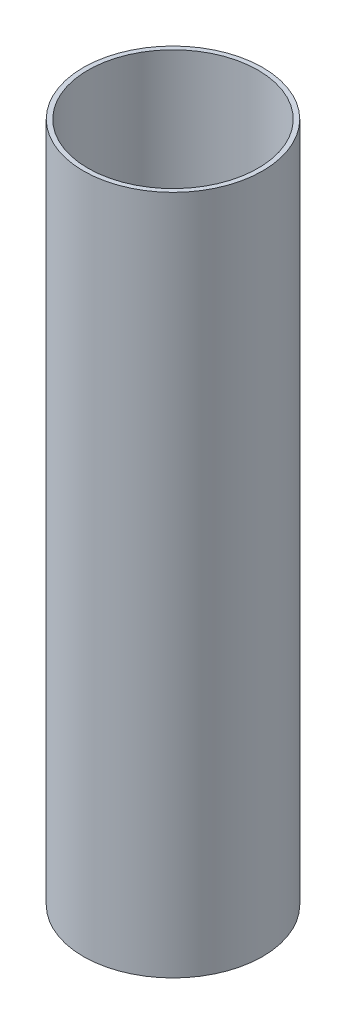
ISO-10303-21;
HEADER;
FILE_DESCRIPTION(('STEP AP214'),'2;1');
FILE_NAME('part.step','',(''),(''),'','','');
FILE_SCHEMA(('AUTOMOTIVE_DESIGN { 1 0 10303 214 1 1 1 1 }'));
ENDSEC;
DATA;
#1=APPLICATION_CONTEXT('core data for automotive mechanical design processes');
#2=APPLICATION_PROTOCOL_DEFINITION('international standard','automotive_design',2000,#1);
#3=PRODUCT_CONTEXT('',#1,'mechanical');
#4=PRODUCT('Part','Part','',(#3));
#5=PRODUCT_RELATED_PRODUCT_CATEGORY('part','',(#4));
#6=PRODUCT_DEFINITION_FORMATION('','',#4);
#7=PRODUCT_DEFINITION_CONTEXT('part definition',#1,'design');
#8=PRODUCT_DEFINITION('design','',#6,#7);
#9=PRODUCT_DEFINITION_SHAPE('','',#8);
#10=(LENGTH_UNIT() NAMED_UNIT(*) SI_UNIT(.MILLI.,.METRE.));
#11=(NAMED_UNIT(*) PLANE_ANGLE_UNIT() SI_UNIT($,.RADIAN.));
#12=(NAMED_UNIT(*) SI_UNIT($,.STERADIAN.) SOLID_ANGLE_UNIT());
#13=UNCERTAINTY_MEASURE_WITH_UNIT(LENGTH_MEASURE(1.E-05),#10,'distance_accuracy_value','');
#14=(GEOMETRIC_REPRESENTATION_CONTEXT(3) GLOBAL_UNCERTAINTY_ASSIGNED_CONTEXT((#13)) GLOBAL_UNIT_ASSIGNED_CONTEXT((#10,
#11,#12)) REPRESENTATION_CONTEXT('',''));
#15=CARTESIAN_POINT('',(0.,0.,0.));
#16=DIRECTION('',(0.,0.,1.));
#17=DIRECTION('',(1.,0.,0.));
#18=AXIS2_PLACEMENT_3D('',#15,#16,#17);
#19=CARTESIAN_POINT('',(0.,-304.8,0.));
#20=DIRECTION('',(0.,1.,0.));
#21=DIRECTION('',(0.,0.,1.));
#22=AXIS2_PLACEMENT_3D('',#19,#20,#21);
#23=CYLINDRICAL_SURFACE('',#22,40.1574);
#24=CARTESIAN_POINT('',(0.,-304.8,0.));
#25=DIRECTION('',(0.,1.,0.));
#26=DIRECTION('',(0.,0.,1.));
#27=AXIS2_PLACEMENT_3D('',#24,#25,#26);
#28=CIRCLE('',#27,40.1574);
#29=CARTESIAN_POINT('',(0.,-304.8,40.1574));
#30=VERTEX_POINT('',#29);
#31=EDGE_CURVE('E10',#30,#30,#28,.T.);
#32=CARTESIAN_POINT('',(0.,0.,0.));
#33=DIRECTION('',(0.,1.,0.));
#34=DIRECTION('',(0.,0.,1.));
#35=AXIS2_PLACEMENT_3D('',#32,#33,#34);
#36=CIRCLE('',#35,40.1574);
#37=CARTESIAN_POINT('',(0.,0.,40.1574));
#38=VERTEX_POINT('',#37);
#39=EDGE_CURVE('E44',#38,#38,#36,.T.);
#40=CARTESIAN_POINT('',(0.,-304.8,40.1574));
#41=CARTESIAN_POINT('',(0.,-301.625,40.1574));
#42=CARTESIAN_POINT('',(0.,-298.45,40.1574));
#43=CARTESIAN_POINT('',(0.,-292.1,40.1574));
#44=CARTESIAN_POINT('',(0.,-288.925,40.1574));
#45=CARTESIAN_POINT('',(0.,-282.575,40.1574));
#46=CARTESIAN_POINT('',(0.,-279.4,40.1574));
#47=CARTESIAN_POINT('',(0.,-273.05,40.1574));
#48=CARTESIAN_POINT('',(0.,-269.875,40.1574));
#49=CARTESIAN_POINT('',(0.,-263.525,40.1574));
#50=CARTESIAN_POINT('',(0.,-260.35,40.1574));
#51=CARTESIAN_POINT('',(0.,-254.,40.1574));
#52=CARTESIAN_POINT('',(0.,-250.825,40.1574));
#53=CARTESIAN_POINT('',(0.,-244.475,40.1574));
#54=CARTESIAN_POINT('',(0.,-241.3,40.1574));
#55=CARTESIAN_POINT('',(0.,-234.95,40.1574));
#56=CARTESIAN_POINT('',(0.,-231.775,40.1574));
#57=CARTESIAN_POINT('',(0.,-225.425,40.1574));
#58=CARTESIAN_POINT('',(0.,-222.25,40.1574));
#59=CARTESIAN_POINT('',(0.,-215.9,40.1574));
#60=CARTESIAN_POINT('',(0.,-212.725,40.1574));
#61=CARTESIAN_POINT('',(0.,-206.375,40.1574));
#62=CARTESIAN_POINT('',(0.,-203.2,40.1574));
#63=CARTESIAN_POINT('',(0.,-196.85,40.1574));
#64=CARTESIAN_POINT('',(0.,-193.675,40.1574));
#65=CARTESIAN_POINT('',(0.,-187.325,40.1574));
#66=CARTESIAN_POINT('',(0.,-184.15,40.1574));
#67=CARTESIAN_POINT('',(0.,-177.8,40.1574));
#68=CARTESIAN_POINT('',(0.,-174.625,40.1574));
#69=CARTESIAN_POINT('',(0.,-168.275,40.1574));
#70=CARTESIAN_POINT('',(0.,-165.1,40.1574));
#71=CARTESIAN_POINT('',(0.,-158.75,40.1574));
#72=CARTESIAN_POINT('',(0.,-155.575,40.1574));
#73=CARTESIAN_POINT('',(0.,-149.225,40.1574));
#74=CARTESIAN_POINT('',(0.,-146.05,40.1574));
#75=CARTESIAN_POINT('',(0.,-139.7,40.1574));
#76=CARTESIAN_POINT('',(0.,-136.525,40.1574));
#77=CARTESIAN_POINT('',(0.,-130.175,40.1574));
#78=CARTESIAN_POINT('',(0.,-127.,40.1574));
#79=CARTESIAN_POINT('',(0.,-120.65,40.1574));
#80=CARTESIAN_POINT('',(0.,-117.475,40.1574));
#81=CARTESIAN_POINT('',(0.,-111.125,40.1574));
#82=CARTESIAN_POINT('',(0.,-107.95,40.1574));
#83=CARTESIAN_POINT('',(0.,-101.6,40.1574));
#84=CARTESIAN_POINT('',(0.,-98.425,40.1574));
#85=CARTESIAN_POINT('',(0.,-92.075,40.1574));
#86=CARTESIAN_POINT('',(0.,-88.9,40.1574));
#87=CARTESIAN_POINT('',(0.,-82.55,40.1574));
#88=CARTESIAN_POINT('',(0.,-79.375,40.1574));
#89=CARTESIAN_POINT('',(0.,-73.025,40.1574));
#90=CARTESIAN_POINT('',(0.,-69.85,40.1574));
#91=CARTESIAN_POINT('',(0.,-63.5,40.1574));
#92=CARTESIAN_POINT('',(0.,-60.325,40.1574));
#93=CARTESIAN_POINT('',(0.,-53.975,40.1574));
#94=CARTESIAN_POINT('',(0.,-50.8,40.1574));
#95=CARTESIAN_POINT('',(0.,-44.45,40.1574));
#96=CARTESIAN_POINT('',(0.,-41.275,40.1574));
#97=CARTESIAN_POINT('',(0.,-34.925,40.1574));
#98=CARTESIAN_POINT('',(0.,-31.75,40.1574));
#99=CARTESIAN_POINT('',(0.,-25.4,40.1574));
#100=CARTESIAN_POINT('',(0.,-22.225,40.1574));
#101=CARTESIAN_POINT('',(0.,-15.875,40.1574));
#102=CARTESIAN_POINT('',(0.,-12.7,40.1574));
#103=CARTESIAN_POINT('',(0.,-6.35,40.1574));
#104=CARTESIAN_POINT('',(0.,-3.175,40.1574));
#105=CARTESIAN_POINT('',(0.,0.,40.1574));
#106=B_SPLINE_CURVE_WITH_KNOTS('',3,(#40,#41,#42,#43,#44,#45,#46,#47,#48,#49,#50,#51,#52,#53,
#54,#55,#56,#57,#58,#59,#60,#61,#62,#63,#64,#65,#66,#67,#68,#69,#70,#71,#72,#73,#74,#75,#76,#77,
#78,#79,#80,#81,#82,#83,#84,#85,#86,#87,#88,#89,#90,#91,#92,#93,#94,#95,#96,#97,#98,#99,#100,
#101,#102,#103,#104,#105),.UNSPECIFIED.,.F.,.F.,(4,2,2,2,2,2,2,2,2,2,2,2,2,2,2,2,2,2,2,2,2,2,2,
2,2,2,2,2,2,2,2,2,4),(0.,9.52499999999995,19.05,28.575,38.1,47.625,57.15,66.675,76.2,85.725,
95.25,104.775,114.3,123.825,133.35,142.875,152.4,161.925,171.45,180.975,190.5,200.025,209.55,
219.075,228.6,238.125,247.65,257.175,266.7,276.225,285.75,295.275,304.8),.UNSPECIFIED.);
#107=EDGE_CURVE('BSEAM41',#30,#38,#106,.T.);
#108=ORIENTED_EDGE('',*,*,#31,.T.);
#109=ORIENTED_EDGE('',*,*,#39,.F.);
#110=ORIENTED_EDGE('',*,*,#107,.T.);
#111=ORIENTED_EDGE('',*,*,#107,.F.);
#112=EDGE_LOOP('',(#108,#110,#109,#111));
#113=FACE_BOUND('',#112,.T.);
#114=ADVANCED_FACE('F41',(#113),#23,.T.);
#115=CARTESIAN_POINT('',(0.,-304.8,0.));
#116=DIRECTION('',(0.,1.,0.));
#117=DIRECTION('',(0.,0.,1.));
#118=AXIS2_PLACEMENT_3D('',#115,#116,#117);
#119=PLANE('',#118);
#120=CARTESIAN_POINT('',(0.,-304.8,0.));
#121=DIRECTION('',(0.,1.,0.));
#122=DIRECTION('',(0.,0.,1.));
#123=AXIS2_PLACEMENT_3D('',#120,#121,#122);
#124=CIRCLE('',#123,38.1);
#125=CARTESIAN_POINT('',(0.,-304.8,38.1));
#126=VERTEX_POINT('',#125);
#127=EDGE_CURVE('E53',#126,#126,#124,.T.);
#128=ORIENTED_EDGE('',*,*,#127,.T.);
#129=EDGE_LOOP('',(#128));
#130=FACE_BOUND('',#129,.T.);
#131=ORIENTED_EDGE('',*,*,#31,.F.);
#132=EDGE_LOOP('',(#131));
#133=FACE_BOUND('',#132,.T.);
#134=ADVANCED_FACE('F63',(#130,#133),#119,.F.);
#135=CARTESIAN_POINT('',(0.,0.,0.));
#136=DIRECTION('',(0.,1.,0.));
#137=DIRECTION('',(0.,0.,1.));
#138=AXIS2_PLACEMENT_3D('',#135,#136,#137);
#139=PLANE('',#138);
#140=CARTESIAN_POINT('',(0.,0.,0.));
#141=DIRECTION('',(0.,1.,0.));
#142=DIRECTION('',(0.,0.,1.));
#143=AXIS2_PLACEMENT_3D('',#140,#141,#142);
#144=CIRCLE('',#143,38.1);
#145=CARTESIAN_POINT('',(0.,0.,38.1));
#146=VERTEX_POINT('',#145);
#147=EDGE_CURVE('E55',#146,#146,#144,.T.);
#148=ORIENTED_EDGE('',*,*,#147,.F.);
#149=EDGE_LOOP('',(#148));
#150=FACE_BOUND('',#149,.T.);
#151=ORIENTED_EDGE('',*,*,#39,.T.);
#152=EDGE_LOOP('',(#151));
#153=FACE_BOUND('',#152,.T.);
#154=ADVANCED_FACE('F69',(#150,#153),#139,.T.);
#155=CARTESIAN_POINT('',(0.,-304.8,0.));
#156=DIRECTION('',(0.,1.,0.));
#157=DIRECTION('',(0.,0.,1.));
#158=AXIS2_PLACEMENT_3D('',#155,#156,#157);
#159=CYLINDRICAL_SURFACE('',#158,38.1);
#160=CARTESIAN_POINT('',(0.,-304.8,38.1));
#161=CARTESIAN_POINT('',(0.,-301.625,38.1));
#162=CARTESIAN_POINT('',(0.,-298.45,38.1));
#163=CARTESIAN_POINT('',(0.,-292.1,38.1));
#164=CARTESIAN_POINT('',(0.,-288.925,38.1));
#165=CARTESIAN_POINT('',(0.,-282.575,38.1));
#166=CARTESIAN_POINT('',(0.,-279.4,38.1));
#167=CARTESIAN_POINT('',(0.,-273.05,38.1));
#168=CARTESIAN_POINT('',(0.,-269.875,38.1));
#169=CARTESIAN_POINT('',(0.,-263.525,38.1));
#170=CARTESIAN_POINT('',(0.,-260.35,38.1));
#171=CARTESIAN_POINT('',(0.,-254.,38.1));
#172=CARTESIAN_POINT('',(0.,-250.825,38.1));
#173=CARTESIAN_POINT('',(0.,-244.475,38.1));
#174=CARTESIAN_POINT('',(0.,-241.3,38.1));
#175=CARTESIAN_POINT('',(0.,-234.95,38.1));
#176=CARTESIAN_POINT('',(0.,-231.775,38.1));
#177=CARTESIAN_POINT('',(0.,-225.425,38.1));
#178=CARTESIAN_POINT('',(0.,-222.25,38.1));
#179=CARTESIAN_POINT('',(0.,-215.9,38.1));
#180=CARTESIAN_POINT('',(0.,-212.725,38.1));
#181=CARTESIAN_POINT('',(0.,-206.375,38.1));
#182=CARTESIAN_POINT('',(0.,-203.2,38.1));
#183=CARTESIAN_POINT('',(0.,-196.85,38.1));
#184=CARTESIAN_POINT('',(0.,-193.675,38.1));
#185=CARTESIAN_POINT('',(0.,-187.325,38.1));
#186=CARTESIAN_POINT('',(0.,-184.15,38.1));
#187=CARTESIAN_POINT('',(0.,-177.8,38.1));
#188=CARTESIAN_POINT('',(0.,-174.625,38.1));
#189=CARTESIAN_POINT('',(0.,-168.275,38.1));
#190=CARTESIAN_POINT('',(0.,-165.1,38.1));
#191=CARTESIAN_POINT('',(0.,-158.75,38.1));
#192=CARTESIAN_POINT('',(0.,-155.575,38.1));
#193=CARTESIAN_POINT('',(0.,-149.225,38.1));
#194=CARTESIAN_POINT('',(0.,-146.05,38.1));
#195=CARTESIAN_POINT('',(0.,-139.7,38.1));
#196=CARTESIAN_POINT('',(0.,-136.525,38.1));
#197=CARTESIAN_POINT('',(0.,-130.175,38.1));
#198=CARTESIAN_POINT('',(0.,-127.,38.1));
#199=CARTESIAN_POINT('',(0.,-120.65,38.1));
#200=CARTESIAN_POINT('',(0.,-117.475,38.1));
#201=CARTESIAN_POINT('',(0.,-111.125,38.1));
#202=CARTESIAN_POINT('',(0.,-107.95,38.1));
#203=CARTESIAN_POINT('',(0.,-101.6,38.1));
#204=CARTESIAN_POINT('',(0.,-98.425,38.1));
#205=CARTESIAN_POINT('',(0.,-92.075,38.1));
#206=CARTESIAN_POINT('',(0.,-88.9,38.1));
#207=CARTESIAN_POINT('',(0.,-82.55,38.1));
#208=CARTESIAN_POINT('',(0.,-79.375,38.1));
#209=CARTESIAN_POINT('',(0.,-73.025,38.1));
#210=CARTESIAN_POINT('',(0.,-69.85,38.1));
#211=CARTESIAN_POINT('',(0.,-63.5,38.1));
#212=CARTESIAN_POINT('',(0.,-60.325,38.1));
#213=CARTESIAN_POINT('',(0.,-53.975,38.1));
#214=CARTESIAN_POINT('',(0.,-50.8,38.1));
#215=CARTESIAN_POINT('',(0.,-44.45,38.1));
#216=CARTESIAN_POINT('',(0.,-41.275,38.1));
#217=CARTESIAN_POINT('',(0.,-34.925,38.1));
#218=CARTESIAN_POINT('',(0.,-31.75,38.1));
#219=CARTESIAN_POINT('',(0.,-25.4,38.1));
#220=CARTESIAN_POINT('',(0.,-22.225,38.1));
#221=CARTESIAN_POINT('',(0.,-15.875,38.1));
#222=CARTESIAN_POINT('',(0.,-12.7,38.1));
#223=CARTESIAN_POINT('',(0.,-6.35,38.1));
#224=CARTESIAN_POINT('',(0.,-3.175,38.1));
#225=CARTESIAN_POINT('',(0.,0.,38.1));
#226=B_SPLINE_CURVE_WITH_KNOTS('',3,(#160,#161,#162,#163,#164,#165,#166,#167,#168,#169,#170,
#171,#172,#173,#174,#175,#176,#177,#178,#179,#180,#181,#182,#183,#184,#185,#186,#187,#188,#189,
#190,#191,#192,#193,#194,#195,#196,#197,#198,#199,#200,#201,#202,#203,#204,#205,#206,#207,#208,
#209,#210,#211,#212,#213,#214,#215,#216,#217,#218,#219,#220,#221,#222,#223,#224,#225),
.UNSPECIFIED.,.F.,.F.,(4,2,2,2,2,2,2,2,2,2,2,2,2,2,2,2,2,2,2,2,2,2,2,2,2,2,2,2,2,2,2,2,4),(0.,
9.52499999999995,19.05,28.575,38.1,47.625,57.15,66.675,76.2,85.725,95.25,104.775,114.3,123.825,
133.35,142.875,152.4,161.925,171.45,180.975,190.5,200.025,209.55,219.075,228.6,238.125,247.65,
257.175,266.7,276.225,285.75,295.275,304.8),.UNSPECIFIED.);
#227=EDGE_CURVE('BSEAM66',#126,#146,#226,.T.);
#228=ORIENTED_EDGE('',*,*,#127,.F.);
#229=ORIENTED_EDGE('',*,*,#147,.T.);
#230=ORIENTED_EDGE('',*,*,#227,.T.);
#231=ORIENTED_EDGE('',*,*,#227,.F.);
#232=EDGE_LOOP('',(#228,#230,#229,#231));
#233=FACE_BOUND('',#232,.T.);
#234=ADVANCED_FACE('F66',(#233),#159,.F.);
#235=CLOSED_SHELL('',(#114,#134,#154,#234));
#236=MANIFOLD_SOLID_BREP('B2',#235);
#237=ADVANCED_BREP_SHAPE_REPRESENTATION('',(#18,#236),#14);
#238=SHAPE_DEFINITION_REPRESENTATION(#9,#237);
ENDSEC;
END-ISO-10303-21;
